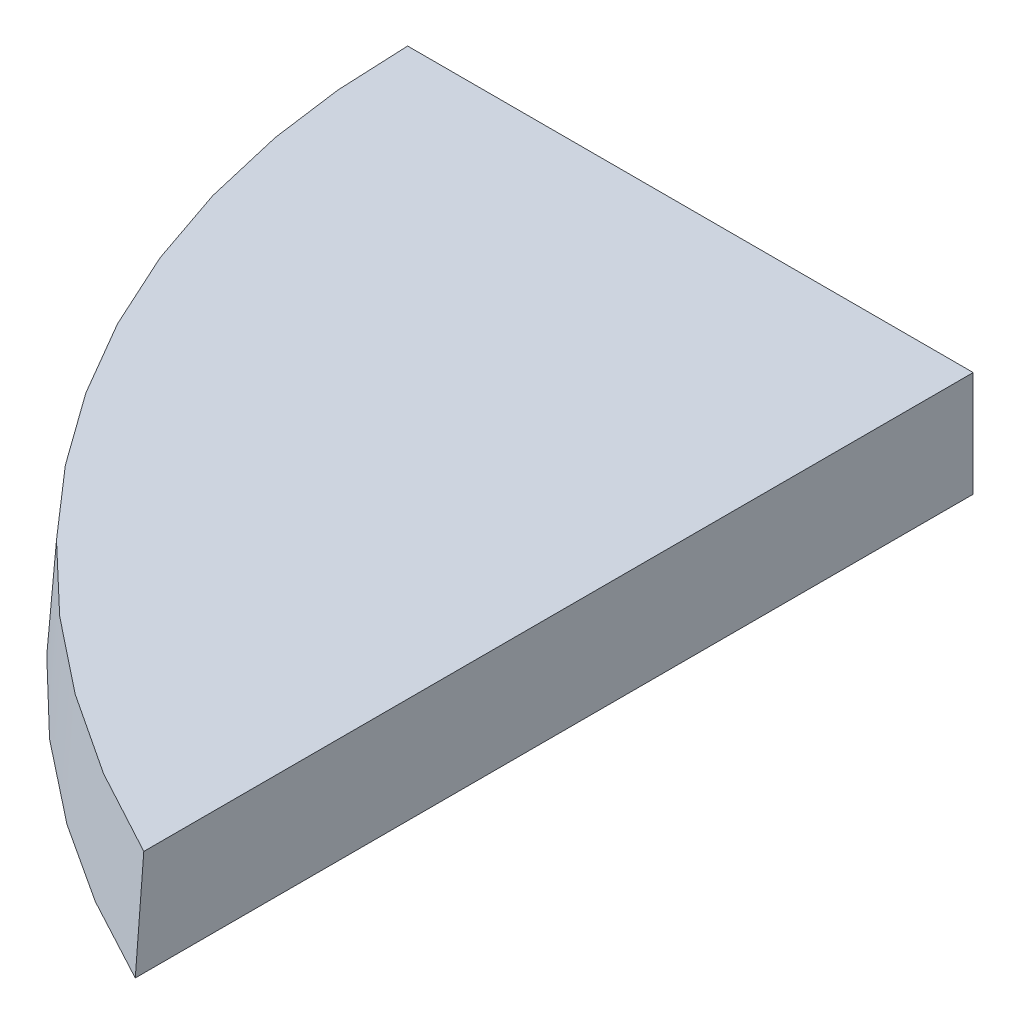
ISO-10303-21;
HEADER;
FILE_DESCRIPTION(('STEP AP214'),'2;1');
FILE_NAME('part.step','',(''),(''),'','','');
FILE_SCHEMA(('AUTOMOTIVE_DESIGN { 1 0 10303 214 1 1 1 1 }'));
ENDSEC;
DATA;
#1=APPLICATION_CONTEXT('core data for automotive mechanical design processes');
#2=APPLICATION_PROTOCOL_DEFINITION('international standard','automotive_design',2000,#1);
#3=PRODUCT_CONTEXT('',#1,'mechanical');
#4=PRODUCT('Part','Part','',(#3));
#5=PRODUCT_RELATED_PRODUCT_CATEGORY('part','',(#4));
#6=PRODUCT_DEFINITION_FORMATION('','',#4);
#7=PRODUCT_DEFINITION_CONTEXT('part definition',#1,'design');
#8=PRODUCT_DEFINITION('design','',#6,#7);
#9=PRODUCT_DEFINITION_SHAPE('','',#8);
#10=(LENGTH_UNIT() NAMED_UNIT(*) SI_UNIT(.MILLI.,.METRE.));
#11=(NAMED_UNIT(*) PLANE_ANGLE_UNIT() SI_UNIT($,.RADIAN.));
#12=(NAMED_UNIT(*) SI_UNIT($,.STERADIAN.) SOLID_ANGLE_UNIT());
#13=UNCERTAINTY_MEASURE_WITH_UNIT(LENGTH_MEASURE(1.E-05),#10,'distance_accuracy_value','');
#14=(GEOMETRIC_REPRESENTATION_CONTEXT(3) GLOBAL_UNCERTAINTY_ASSIGNED_CONTEXT((#13)) GLOBAL_UNIT_ASSIGNED_CONTEXT((#10,
#11,#12)) REPRESENTATION_CONTEXT('',''));
#15=CARTESIAN_POINT('',(0.,0.,0.));
#16=DIRECTION('',(0.,0.,1.));
#17=DIRECTION('',(1.,0.,0.));
#18=AXIS2_PLACEMENT_3D('',#15,#16,#17);
#19=CARTESIAN_POINT('',(0.,0.,0.));
#20=DIRECTION('',(0.,0.,1.));
#21=DIRECTION('',(1.,0.,0.));
#22=AXIS2_PLACEMENT_3D('',#19,#20,#21);
#23=PLANE('',#22);
#24=CARTESIAN_POINT('',(-37.5,-190.,0.));
#25=CARTESIAN_POINT('',(-37.4293854668902,-188.833333333333,0.));
#26=CARTESIAN_POINT('',(-37.3587709337804,-187.666666666667,0.));
#27=CARTESIAN_POINT('',(-37.2881564006706,-186.5,0.));
#28=B_SPLINE_CURVE_WITH_KNOTS('',3,(#24,#25,#26,#27),.UNSPECIFIED.,.F.,.F.,(4,4),(0.,
3.50640524049586),.UNSPECIFIED.);
#29=CARTESIAN_POINT('',(-37.5,-190.,0.));
#30=VERTEX_POINT('',#29);
#31=CARTESIAN_POINT('',(-37.2881564006706,-186.5,0.));
#32=VERTEX_POINT('',#31);
#33=EDGE_CURVE('E82',#30,#32,#28,.T.);
#34=ORIENTED_EDGE('',*,*,#33,.T.);
#35=DIRECTION('',(-1.,0.,0.));
#36=VECTOR('',#35,1.);
#37=CARTESIAN_POINT('',(0.,-186.5,0.));
#38=LINE('',#37,#36);
#39=CARTESIAN_POINT('',(-18.5,-186.5,0.));
#40=VERTEX_POINT('',#39);
#41=EDGE_CURVE('E54',#40,#32,#38,.T.);
#42=ORIENTED_EDGE('',*,*,#41,.F.);
#43=DIRECTION('',(0.,-1.,0.));
#44=VECTOR('',#43,1.);
#45=CARTESIAN_POINT('',(-18.5,0.,0.));
#46=LINE('',#45,#44);
#47=CARTESIAN_POINT('',(-18.5,-190.,0.));
#48=VERTEX_POINT('',#47);
#49=EDGE_CURVE('E89',#40,#48,#46,.T.);
#50=ORIENTED_EDGE('',*,*,#49,.T.);
#51=DIRECTION('',(1.,0.,0.));
#52=VECTOR('',#51,1.);
#53=CARTESIAN_POINT('',(0.,-190.,0.));
#54=LINE('',#53,#52);
#55=EDGE_CURVE('E67',#30,#48,#54,.T.);
#56=ORIENTED_EDGE('',*,*,#55,.F.);
#57=EDGE_LOOP('',(#34,#42,#50,#56));
#58=FACE_BOUND('',#57,.T.);
#59=ADVANCED_FACE('F43',(#58),#23,.F.);
#60=CARTESIAN_POINT('',(-18.5,-156.5,21.131836958515));
#61=DIRECTION('',(-1.,0.,0.));
#62=DIRECTION('',(0.,0.,1.));
#63=AXIS2_PLACEMENT_3D('',#60,#61,#62);
#64=PLANE('',#63);
#65=CARTESIAN_POINT('',(-18.5,-186.5,27.5518127987688));
#66=CARTESIAN_POINT('',(-18.5,-187.666666666667,27.6461721906388));
#67=CARTESIAN_POINT('',(-18.5,-188.833333333333,27.7405315825088));
#68=CARTESIAN_POINT('',(-18.5,-190.,27.8348909743788));
#69=B_SPLINE_CURVE_WITH_KNOTS('',3,(#65,#66,#67,#68),.UNSPECIFIED.,.F.,.F.,(4,4),(0.,
3.51142894752363),.UNSPECIFIED.);
#70=CARTESIAN_POINT('',(-18.5,-186.5,27.5518127987688));
#71=VERTEX_POINT('',#70);
#72=CARTESIAN_POINT('',(-18.4999997004693,-190.,27.8348918832198));
#73=VERTEX_POINT('',#72);
#74=EDGE_CURVE('E87',#71,#73,#69,.T.);
#75=ORIENTED_EDGE('',*,*,#74,.T.);
#76=DIRECTION('',(0.,0.,1.));
#77=VECTOR('',#76,1.);
#78=CARTESIAN_POINT('',(-18.5,-190.,0.));
#79=LINE('',#78,#77);
#80=EDGE_CURVE('E92',#48,#73,#79,.T.);
#81=ORIENTED_EDGE('',*,*,#80,.F.);
#82=ORIENTED_EDGE('',*,*,#49,.F.);
#83=DIRECTION('',(0.,0.,-1.));
#84=VECTOR('',#83,1.);
#85=CARTESIAN_POINT('',(-18.5,-186.5,22.7810494772116));
#86=LINE('',#85,#84);
#87=EDGE_CURVE('E11',#71,#40,#86,.T.);
#88=ORIENTED_EDGE('',*,*,#87,.F.);
#89=EDGE_LOOP('',(#75,#81,#82,#88));
#90=FACE_BOUND('',#89,.T.);
#91=ADVANCED_FACE('F106',(#90),#64,.F.);
#92=CARTESIAN_POINT('',(0.086150742203567,-186.5,-28.2226236497702));
#93=DIRECTION('',(0.,1.,0.));
#94=DIRECTION('',(0.,0.,1.));
#95=AXIS2_PLACEMENT_3D('',#92,#93,#94);
#96=PLANE('',#95);
#97=CARTESIAN_POINT('',(-18.5,-186.5,27.5518127987688));
#98=CARTESIAN_POINT('',(-19.13424496103,-186.5,27.2433861780697));
#99=CARTESIAN_POINT('',(-19.7602595182414,-186.5,26.9179102296643));
#100=CARTESIAN_POINT('',(-20.9941592450243,-186.5,26.2327102293309));
#101=CARTESIAN_POINT('',(-21.6020234435852,-186.5,25.8729484323788));
#102=CARTESIAN_POINT('',(-22.7967536854488,-186.5,25.1195745774586));
#103=CARTESIAN_POINT('',(-23.3836117927958,-186.5,24.7259499135404));
#104=CARTESIAN_POINT('',(-24.5358120373182,-186.5,23.9037429357539));
#105=CARTESIAN_POINT('',(-25.1010602762511,-186.5,23.4750289807309));
#106=CARTESIAN_POINT('',(-26.2047471529344,-186.5,22.5846513054033));
#107=CARTESIAN_POINT('',(-26.7431952566689,-186.5,22.1229993612415));
#108=CARTESIAN_POINT('',(-27.5286107322949,-186.5,21.4064474539673));
#109=CARTESIAN_POINT('',(-27.7866728181477,-186.5,21.1636191907219));
#110=CARTESIAN_POINT('',(-28.2951358769013,-186.5,20.669955035876));
#111=CARTESIAN_POINT('',(-28.5455349524826,-186.5,20.4191171920628));
#112=CARTESIAN_POINT('',(-29.3924807142885,-186.5,19.5432842950554));
#113=CARTESIAN_POINT('',(-29.9691451566113,-186.5,18.8988112681566));
#114=CARTESIAN_POINT('',(-31.0688807123937,-186.5,17.5656038817533));
#115=CARTESIAN_POINT('',(-31.5919541720535,-186.5,16.8768714620643));
#116=CARTESIAN_POINT('',(-32.3318407081379,-186.5,15.8134806966134));
#117=CARTESIAN_POINT('',(-32.5709096973067,-186.5,15.4541513895216));
#118=CARTESIAN_POINT('',(-33.0335906549448,-186.5,14.725743545315));
#119=CARTESIAN_POINT('',(-33.257205687976,-186.5,14.3566669612918));
#120=CARTESIAN_POINT('',(-33.6883560025939,-186.5,13.6091959500606));
#121=CARTESIAN_POINT('',(-33.89588994353,-186.5,13.2308007494349));
#122=CARTESIAN_POINT('',(-34.2941967322295,-186.5,12.4653040704603));
#123=CARTESIAN_POINT('',(-34.4849698721206,-186.5,12.0782027440001));
#124=CARTESIAN_POINT('',(-34.9114849990752,-186.5,11.161937469348));
#125=CARTESIAN_POINT('',(-35.140261444418,-186.5,10.6295099493701));
#126=CARTESIAN_POINT('',(-35.5650467747675,-186.5,9.55170029958014));
#127=CARTESIAN_POINT('',(-35.7610531752087,-186.5,9.00631719107578));
#128=CARTESIAN_POINT('',(-36.1190285889145,-186.5,7.90435548099774));
#129=CARTESIAN_POINT('',(-36.2809908017753,-186.5,7.34777466693965));
#130=CARTESIAN_POINT('',(-36.5694123759568,-186.5,6.22668340540645));
#131=CARTESIAN_POINT('',(-36.6959431928343,-186.5,5.66219136396606));
#132=CARTESIAN_POINT('',(-36.9130141618155,-186.5,4.52645062420798));
#133=CARTESIAN_POINT('',(-37.0035615279002,-186.5,3.95520330386383));
#134=CARTESIAN_POINT('',(-37.1479776131428,-186.5,2.80852823963838));
#135=CARTESIAN_POINT('',(-37.2018770921231,-186.5,2.23310441230581));
#136=CARTESIAN_POINT('',(-37.254249691652,-186.5,1.38068997752244));
#137=CARTESIAN_POINT('',(-37.2669691642289,-186.5,1.10450997321702));
#138=CARTESIAN_POINT('',(-37.2839165407268,-186.5,0.552226226374927));
#139=CARTESIAN_POINT('',(-37.2881547663925,-186.5,0.276122800521893));
#140=CARTESIAN_POINT('',(-37.2881564006706,-186.5,0.));
#141=B_SPLINE_CURVE_WITH_KNOTS('',3,(#97,#98,#99,#100,#101,#102,#103,#104,#105,#106,#107,#108,
#109,#110,#111,#112,#113,#114,#115,#116,#117,#118,#119,#120,#121,#122,#123,#124,#125,#126,#127,
#128,#129,#130,#131,#132,#133,#134,#135,#136,#137,#138,#139,#140),.UNSPECIFIED.,.F.,.F.,(4,2,2,
2,2,2,2,2,2,2,2,2,2,2,2,2,2,2,2,2,2,4),(0.,2.11561118893159,4.23357895107312,6.35233859818849,
8.47944738782626,10.6057994580908,11.6686860640639,12.7318337401211,15.3233791305614,
17.9148110152467,19.2092625223401,20.5034565951765,21.7977584467259,23.0920377351324,
24.8294338241018,26.5669615796174,28.30483608112,30.0391800940297,31.7731762291213,
33.5057151594999,34.3350224065187,35.1633197647453),.UNSPECIFIED.);
#142=EDGE_CURVE('E83',#71,#32,#141,.T.);
#143=ORIENTED_EDGE('',*,*,#142,.F.);
#144=ORIENTED_EDGE('',*,*,#87,.T.);
#145=ORIENTED_EDGE('',*,*,#41,.T.);
#146=EDGE_LOOP('',(#143,#144,#145));
#147=FACE_BOUND('',#146,.T.);
#148=ADVANCED_FACE('F80',(#147),#96,.T.);
#149=CARTESIAN_POINT('',(-0.0942476803876341,-190.,31.9998989353041));
#150=CARTESIAN_POINT('',(0.,0.,17.5));
#151=CARTESIAN_POINT('',(0.000942476803874733,1.9,17.355001010647));
#152=CARTESIAN_POINT('',(74.9055154492315,-190.,32.1607483098324));
#153=CARTESIAN_POINT('',(52.,0.,17.5));
#154=CARTESIAN_POINT('',(51.7709448455077,1.9,17.3533925169017));
#155=CARTESIAN_POINT('',(75.0940108100067,-190.,-31.839049560776));
#156=CARTESIAN_POINT('',(52.,0.,-17.5));
#157=CARTESIAN_POINT('',(51.7690598918999,1.9,-17.3566095043922));
#158=CARTESIAN_POINT('',(0.0942476803875962,-190.,-31.9998989353041));
#159=CARTESIAN_POINT('',(0.,0.,-17.5));
#160=CARTESIAN_POINT('',(-0.000942476803871138,1.9,-17.355001010647));
#161=CARTESIAN_POINT('',(-74.9055154492314,-190.,-32.1607483098323));
#162=CARTESIAN_POINT('',(-52.,0.,-17.5));
#163=CARTESIAN_POINT('',(-51.7709448455077,1.9,-17.3533925169017));
#164=CARTESIAN_POINT('',(-75.0940108100066,-190.,31.839049560776));
#165=CARTESIAN_POINT('',(-52.,0.,17.5));
#166=CARTESIAN_POINT('',(-51.7690598918999,1.9,17.3566095043922));
#167=CARTESIAN_POINT('',(-0.0942476803876341,-190.,31.9998989353041));
#168=CARTESIAN_POINT('',(0.,0.,17.5));
#169=CARTESIAN_POINT('',(0.000942476803874733,1.9,17.355001010647));
#170=(BOUNDED_SURFACE() B_SPLINE_SURFACE(3,1,((#149,#150,#151),(#152,#153,#154),(#155,#156,
#157),(#158,#159,#160),(#161,#162,#163),(#164,#165,#166),(#167,#168,#169)),.UNSPECIFIED.,.T.,
.F.,.F.) B_SPLINE_SURFACE_WITH_KNOTS((4,3,4),(2,1,2),(0.,0.5,1.),(0.,1.,1.01),
.UNSPECIFIED.) GEOMETRIC_REPRESENTATION_ITEM() RATIONAL_B_SPLINE_SURFACE(((1.,1.,1.),
(0.333333333333333,0.333333333333333,0.333333333333333),(0.333333333333333,0.333333333333333,
0.333333333333333),(1.,1.,1.),(0.333333333333333,0.333333333333333,0.333333333333333),
(0.333333333333333,0.333333333333333,0.333333333333333),(1.,1.,1.))) REPRESENTATION_ITEM('') SURFACE());
#171=CARTESIAN_POINT('',(0.,-190.,0.));
#172=DIRECTION('',(0.,1.,0.));
#173=DIRECTION('',(1.,0.,0.));
#174=AXIS2_PLACEMENT_3D('',#171,#172,#173);
#175=ELLIPSE('',#174,37.5,32.);
#176=EDGE_CURVE('E81',#30,#73,#175,.T.);
#177=ORIENTED_EDGE('',*,*,#74,.F.);
#178=ORIENTED_EDGE('',*,*,#142,.T.);
#179=ORIENTED_EDGE('',*,*,#33,.F.);
#180=ORIENTED_EDGE('',*,*,#176,.T.);
#181=EDGE_LOOP('',(#177,#178,#179,#180));
#182=FACE_BOUND('',#181,.T.);
#183=ADVANCED_FACE('F44',(#182),#170,.T.);
#184=CARTESIAN_POINT('',(0.,-190.,0.));
#185=DIRECTION('',(0.,1.,0.));
#186=DIRECTION('',(0.,0.,1.));
#187=AXIS2_PLACEMENT_3D('',#184,#185,#186);
#188=PLANE('',#187);
#189=ORIENTED_EDGE('',*,*,#55,.T.);
#190=ORIENTED_EDGE('',*,*,#80,.T.);
#191=ORIENTED_EDGE('',*,*,#176,.F.);
#192=EDGE_LOOP('',(#189,#190,#191));
#193=FACE_BOUND('',#192,.T.);
#194=ADVANCED_FACE('F108',(#193),#188,.F.);
#195=CLOSED_SHELL('',(#59,#91,#148,#183,#194));
#196=MANIFOLD_SOLID_BREP('B2',#195);
#197=ADVANCED_BREP_SHAPE_REPRESENTATION('',(#18,#196),#14);
#198=SHAPE_DEFINITION_REPRESENTATION(#9,#197);
ENDSEC;
END-ISO-10303-21;
